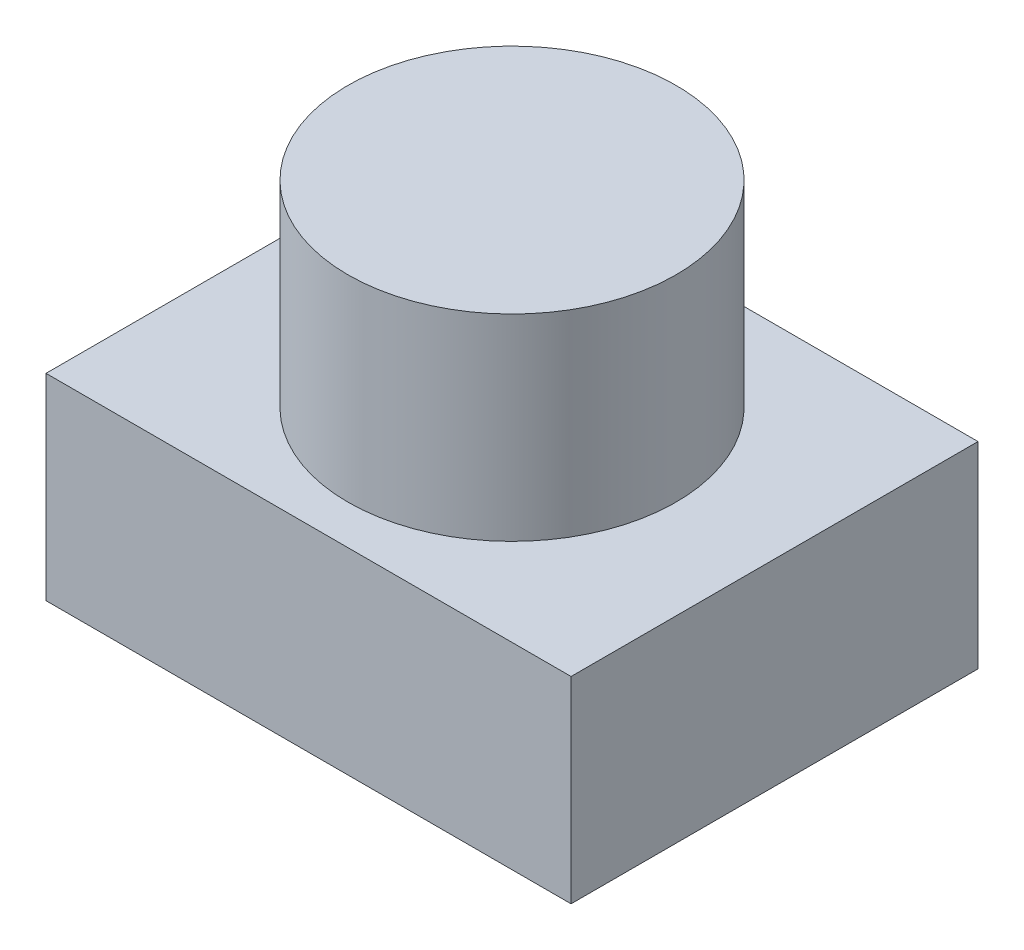
ISO-10303-21;
HEADER;
FILE_DESCRIPTION(('STEP AP214'),'2;1');
FILE_NAME('part.step','',(''),(''),'','','');
FILE_SCHEMA(('AUTOMOTIVE_DESIGN { 1 0 10303 214 1 1 1 1 }'));
ENDSEC;
DATA;
#1=APPLICATION_CONTEXT('core data for automotive mechanical design processes');
#2=APPLICATION_PROTOCOL_DEFINITION('international standard','automotive_design',2000,#1);
#3=PRODUCT_CONTEXT('',#1,'mechanical');
#4=PRODUCT('Part','Part','',(#3));
#5=PRODUCT_RELATED_PRODUCT_CATEGORY('part','',(#4));
#6=PRODUCT_DEFINITION_FORMATION('','',#4);
#7=PRODUCT_DEFINITION_CONTEXT('part definition',#1,'design');
#8=PRODUCT_DEFINITION('design','',#6,#7);
#9=PRODUCT_DEFINITION_SHAPE('','',#8);
#10=(LENGTH_UNIT() NAMED_UNIT(*) SI_UNIT(.MILLI.,.METRE.));
#11=(NAMED_UNIT(*) PLANE_ANGLE_UNIT() SI_UNIT($,.RADIAN.));
#12=(NAMED_UNIT(*) SI_UNIT($,.STERADIAN.) SOLID_ANGLE_UNIT());
#13=UNCERTAINTY_MEASURE_WITH_UNIT(LENGTH_MEASURE(1.E-05),#10,'distance_accuracy_value','');
#14=(GEOMETRIC_REPRESENTATION_CONTEXT(3) GLOBAL_UNCERTAINTY_ASSIGNED_CONTEXT((#13)) GLOBAL_UNIT_ASSIGNED_CONTEXT((#10,
#11,#12)) REPRESENTATION_CONTEXT('',''));
#15=CARTESIAN_POINT('',(0.,0.,0.));
#16=DIRECTION('',(0.,0.,1.));
#17=DIRECTION('',(1.,0.,0.));
#18=AXIS2_PLACEMENT_3D('',#15,#16,#17);
#19=CARTESIAN_POINT('',(20.,15.,15.5));
#20=DIRECTION('',(-1.,0.,0.));
#21=DIRECTION('',(0.,0.,1.));
#22=AXIS2_PLACEMENT_3D('',#19,#20,#21);
#23=PLANE('',#22);
#24=DIRECTION('',(0.,0.,-1.));
#25=VECTOR('',#24,1.);
#26=CARTESIAN_POINT('',(20.,0.,15.5));
#27=LINE('',#26,#25);
#28=CARTESIAN_POINT('',(20.,0.,15.5));
#29=VERTEX_POINT('',#28);
#30=CARTESIAN_POINT('',(20.,0.,-15.5));
#31=VERTEX_POINT('',#30);
#32=EDGE_CURVE('E103',#29,#31,#27,.T.);
#33=ORIENTED_EDGE('',*,*,#32,.T.);
#34=DIRECTION('',(0.,-1.,0.));
#35=VECTOR('',#34,1.);
#36=CARTESIAN_POINT('',(20.,15.,-15.5));
#37=LINE('',#36,#35);
#38=CARTESIAN_POINT('',(20.,15.,-15.5));
#39=VERTEX_POINT('',#38);
#40=EDGE_CURVE('E37',#39,#31,#37,.T.);
#41=ORIENTED_EDGE('',*,*,#40,.F.);
#42=DIRECTION('',(0.,0.,-1.));
#43=VECTOR('',#42,1.);
#44=CARTESIAN_POINT('',(20.,15.,15.5));
#45=LINE('',#44,#43);
#46=CARTESIAN_POINT('',(20.,15.,15.5));
#47=VERTEX_POINT('',#46);
#48=EDGE_CURVE('E89',#47,#39,#45,.T.);
#49=ORIENTED_EDGE('',*,*,#48,.F.);
#50=DIRECTION('',(0.,-1.,0.));
#51=VECTOR('',#50,1.);
#52=CARTESIAN_POINT('',(20.,15.,15.5));
#53=LINE('',#52,#51);
#54=EDGE_CURVE('E97',#47,#29,#53,.T.);
#55=ORIENTED_EDGE('',*,*,#54,.T.);
#56=EDGE_LOOP('',(#33,#41,#49,#55));
#57=FACE_BOUND('',#56,.T.);
#58=ADVANCED_FACE('F40',(#57),#23,.F.);
#59=CARTESIAN_POINT('',(-20.,15.,-15.5));
#60=DIRECTION('',(0.,0.,1.));
#61=DIRECTION('',(1.,0.,0.));
#62=AXIS2_PLACEMENT_3D('',#59,#60,#61);
#63=PLANE('',#62);
#64=DIRECTION('',(-1.,0.,0.));
#65=VECTOR('',#64,1.);
#66=CARTESIAN_POINT('',(-20.,0.,-15.5));
#67=LINE('',#66,#65);
#68=CARTESIAN_POINT('',(-20.,0.,-15.5));
#69=VERTEX_POINT('',#68);
#70=EDGE_CURVE('E92',#31,#69,#67,.T.);
#71=ORIENTED_EDGE('',*,*,#70,.T.);
#72=DIRECTION('',(0.,-1.,0.));
#73=VECTOR('',#72,1.);
#74=CARTESIAN_POINT('',(-20.,15.,-15.5));
#75=LINE('',#74,#73);
#76=CARTESIAN_POINT('',(-20.,15.,-15.5));
#77=VERTEX_POINT('',#76);
#78=EDGE_CURVE('E91',#77,#69,#75,.T.);
#79=ORIENTED_EDGE('',*,*,#78,.F.);
#80=DIRECTION('',(-1.,0.,0.));
#81=VECTOR('',#80,1.);
#82=CARTESIAN_POINT('',(-20.,15.,-15.5));
#83=LINE('',#82,#81);
#84=EDGE_CURVE('E84',#39,#77,#83,.T.);
#85=ORIENTED_EDGE('',*,*,#84,.F.);
#86=ORIENTED_EDGE('',*,*,#40,.T.);
#87=EDGE_LOOP('',(#71,#79,#85,#86));
#88=FACE_BOUND('',#87,.T.);
#89=ADVANCED_FACE('F94',(#88),#63,.F.);
#90=CARTESIAN_POINT('',(-20.,15.,15.5));
#91=DIRECTION('',(1.,0.,0.));
#92=DIRECTION('',(0.,0.,-1.));
#93=AXIS2_PLACEMENT_3D('',#90,#91,#92);
#94=PLANE('',#93);
#95=DIRECTION('',(0.,0.,1.));
#96=VECTOR('',#95,1.);
#97=CARTESIAN_POINT('',(-20.,0.,15.5));
#98=LINE('',#97,#96);
#99=CARTESIAN_POINT('',(-20.,0.,15.5));
#100=VERTEX_POINT('',#99);
#101=EDGE_CURVE('E72',#69,#100,#98,.T.);
#102=ORIENTED_EDGE('',*,*,#101,.T.);
#103=DIRECTION('',(0.,-1.,0.));
#104=VECTOR('',#103,1.);
#105=CARTESIAN_POINT('',(-20.,15.,15.5));
#106=LINE('',#105,#104);
#107=CARTESIAN_POINT('',(-20.,15.,15.5));
#108=VERTEX_POINT('',#107);
#109=EDGE_CURVE('E96',#108,#100,#106,.T.);
#110=ORIENTED_EDGE('',*,*,#109,.F.);
#111=DIRECTION('',(0.,0.,1.));
#112=VECTOR('',#111,1.);
#113=CARTESIAN_POINT('',(-20.,15.,15.5));
#114=LINE('',#113,#112);
#115=EDGE_CURVE('E86',#77,#108,#114,.T.);
#116=ORIENTED_EDGE('',*,*,#115,.F.);
#117=ORIENTED_EDGE('',*,*,#78,.T.);
#118=EDGE_LOOP('',(#102,#110,#116,#117));
#119=FACE_BOUND('',#118,.T.);
#120=ADVANCED_FACE('F100',(#119),#94,.F.);
#121=CARTESIAN_POINT('',(-20.,15.,15.5));
#122=DIRECTION('',(0.,0.,-1.));
#123=DIRECTION('',(-1.,0.,0.));
#124=AXIS2_PLACEMENT_3D('',#121,#122,#123);
#125=PLANE('',#124);
#126=DIRECTION('',(1.,0.,0.));
#127=VECTOR('',#126,1.);
#128=CARTESIAN_POINT('',(-20.,0.,15.5));
#129=LINE('',#128,#127);
#130=EDGE_CURVE('E80',#100,#29,#129,.T.);
#131=ORIENTED_EDGE('',*,*,#130,.T.);
#132=ORIENTED_EDGE('',*,*,#54,.F.);
#133=DIRECTION('',(1.,0.,0.));
#134=VECTOR('',#133,1.);
#135=CARTESIAN_POINT('',(-20.,15.,15.5));
#136=LINE('',#135,#134);
#137=EDGE_CURVE('E53',#108,#47,#136,.T.);
#138=ORIENTED_EDGE('',*,*,#137,.F.);
#139=ORIENTED_EDGE('',*,*,#109,.T.);
#140=EDGE_LOOP('',(#131,#132,#138,#139));
#141=FACE_BOUND('',#140,.T.);
#142=ADVANCED_FACE('F112',(#141),#125,.F.);
#143=CARTESIAN_POINT('',(0.,15.,0.));
#144=DIRECTION('',(0.,-1.,0.));
#145=DIRECTION('',(0.,0.,-1.));
#146=AXIS2_PLACEMENT_3D('',#143,#144,#145);
#147=PLANE('',#146);
#148=CARTESIAN_POINT('',(0.,15.,0.));
#149=DIRECTION('',(0.,1.,0.));
#150=DIRECTION('',(0.,0.,1.));
#151=AXIS2_PLACEMENT_3D('',#148,#149,#150);
#152=CIRCLE('',#151,12.5);
#153=CARTESIAN_POINT('',(0.,15.,12.5));
#154=VERTEX_POINT('',#153);
#155=EDGE_CURVE('E11',#154,#154,#152,.T.);
#156=ORIENTED_EDGE('',*,*,#155,.F.);
#157=EDGE_LOOP('',(#156));
#158=FACE_BOUND('',#157,.T.);
#159=ORIENTED_EDGE('',*,*,#48,.T.);
#160=ORIENTED_EDGE('',*,*,#84,.T.);
#161=ORIENTED_EDGE('',*,*,#115,.T.);
#162=ORIENTED_EDGE('',*,*,#137,.T.);
#163=EDGE_LOOP('',(#159,#160,#161,#162));
#164=FACE_BOUND('',#163,.T.);
#165=ADVANCED_FACE('F88',(#158,#164),#147,.F.);
#166=CARTESIAN_POINT('',(0.,0.,0.));
#167=DIRECTION('',(0.,-1.,0.));
#168=DIRECTION('',(0.,0.,-1.));
#169=AXIS2_PLACEMENT_3D('',#166,#167,#168);
#170=PLANE('',#169);
#171=ORIENTED_EDGE('',*,*,#32,.F.);
#172=ORIENTED_EDGE('',*,*,#130,.F.);
#173=ORIENTED_EDGE('',*,*,#101,.F.);
#174=ORIENTED_EDGE('',*,*,#70,.F.);
#175=EDGE_LOOP('',(#171,#172,#173,#174));
#176=FACE_BOUND('',#175,.T.);
#177=ADVANCED_FACE('F111',(#176),#170,.T.);
#178=CARTESIAN_POINT('',(0.,30.,0.));
#179=DIRECTION('',(0.,-1.,0.));
#180=DIRECTION('',(0.,0.,-1.));
#181=AXIS2_PLACEMENT_3D('',#178,#179,#180);
#182=CYLINDRICAL_SURFACE('',#181,12.5);
#183=CARTESIAN_POINT('',(0.,30.,0.));
#184=DIRECTION('',(0.,1.,0.));
#185=DIRECTION('',(0.,0.,1.));
#186=AXIS2_PLACEMENT_3D('',#183,#184,#185);
#187=CIRCLE('',#186,12.5);
#188=CARTESIAN_POINT('',(0.,30.,12.5));
#189=VERTEX_POINT('',#188);
#190=EDGE_CURVE('E106',#189,#189,#187,.T.);
#191=ORIENTED_EDGE('',*,*,#190,.F.);
#192=EDGE_LOOP('',(#191));
#193=FACE_BOUND('',#192,.T.);
#194=ORIENTED_EDGE('',*,*,#155,.T.);
#195=EDGE_LOOP('',(#194));
#196=FACE_BOUND('',#195,.T.);
#197=ADVANCED_FACE('F125',(#193,#196),#182,.T.);
#198=CARTESIAN_POINT('',(0.,30.,0.));
#199=DIRECTION('',(0.,1.,0.));
#200=DIRECTION('',(0.,0.,1.));
#201=AXIS2_PLACEMENT_3D('',#198,#199,#200);
#202=PLANE('',#201);
#203=ORIENTED_EDGE('',*,*,#190,.T.);
#204=EDGE_LOOP('',(#203));
#205=FACE_BOUND('',#204,.T.);
#206=ADVANCED_FACE('F118',(#205),#202,.T.);
#207=CLOSED_SHELL('',(#58,#89,#120,#142,#165,#177,#197,#206));
#208=MANIFOLD_SOLID_BREP('B2',#207);
#209=ADVANCED_BREP_SHAPE_REPRESENTATION('',(#18,#208),#14);
#210=SHAPE_DEFINITION_REPRESENTATION(#9,#209);
ENDSEC;
END-ISO-10303-21;
